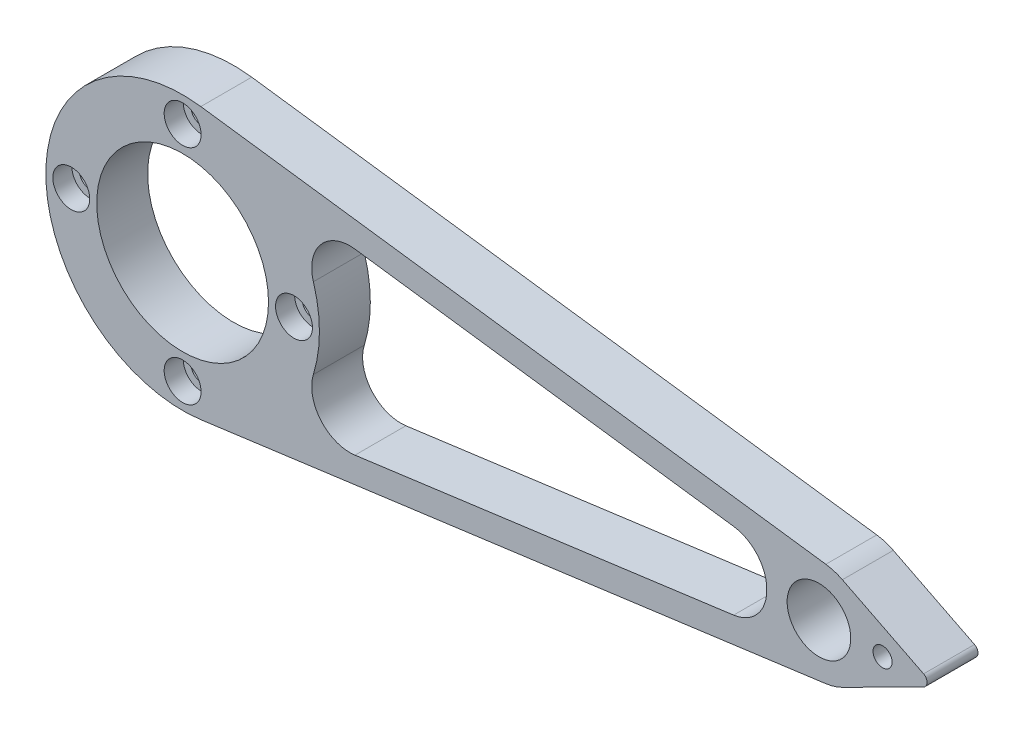
ISO-10303-21;
HEADER;
FILE_DESCRIPTION(('STEP AP214'),'2;1');
FILE_NAME('part.step','',(''),(''),'','','');
FILE_SCHEMA(('AUTOMOTIVE_DESIGN { 1 0 10303 214 1 1 1 1 }'));
ENDSEC;
DATA;
#1=APPLICATION_CONTEXT('core data for automotive mechanical design processes');
#2=APPLICATION_PROTOCOL_DEFINITION('international standard','automotive_design',2000,#1);
#3=PRODUCT_CONTEXT('',#1,'mechanical');
#4=PRODUCT('Part','Part','',(#3));
#5=PRODUCT_RELATED_PRODUCT_CATEGORY('part','',(#4));
#6=PRODUCT_DEFINITION_FORMATION('','',#4);
#7=PRODUCT_DEFINITION_CONTEXT('part definition',#1,'design');
#8=PRODUCT_DEFINITION('design','',#6,#7);
#9=PRODUCT_DEFINITION_SHAPE('','',#8);
#10=(LENGTH_UNIT() NAMED_UNIT(*) SI_UNIT(.MILLI.,.METRE.));
#11=(NAMED_UNIT(*) PLANE_ANGLE_UNIT() SI_UNIT($,.RADIAN.));
#12=(NAMED_UNIT(*) SI_UNIT($,.STERADIAN.) SOLID_ANGLE_UNIT());
#13=UNCERTAINTY_MEASURE_WITH_UNIT(LENGTH_MEASURE(1.E-05),#10,'distance_accuracy_value','');
#14=(GEOMETRIC_REPRESENTATION_CONTEXT(3) GLOBAL_UNCERTAINTY_ASSIGNED_CONTEXT((#13)) GLOBAL_UNIT_ASSIGNED_CONTEXT((#10,
#11,#12)) REPRESENTATION_CONTEXT('',''));
#15=CARTESIAN_POINT('',(0.,0.,0.));
#16=DIRECTION('',(0.,0.,1.));
#17=DIRECTION('',(1.,0.,0.));
#18=AXIS2_PLACEMENT_3D('',#15,#16,#17);
#19=CARTESIAN_POINT('',(17.5000000000002,1.70499640412445E-13,8.));
#20=DIRECTION('',(0.,0.,-1.));
#21=DIRECTION('',(-1.,0.,0.));
#22=AXIS2_PLACEMENT_3D('',#19,#20,#21);
#23=CYLINDRICAL_SURFACE('',#22,1.7);
#24=CARTESIAN_POINT('',(17.5000000000002,1.70499640412445E-13,0.));
#25=DIRECTION('',(0.,0.,1.));
#26=DIRECTION('',(1.,0.,0.));
#27=AXIS2_PLACEMENT_3D('',#24,#25,#26);
#28=CIRCLE('',#27,1.7);
#29=CARTESIAN_POINT('',(19.2000000000002,1.70499640412445E-13,0.));
#30=VERTEX_POINT('',#29);
#31=EDGE_CURVE('E211',#30,#30,#28,.T.);
#32=ORIENTED_EDGE('',*,*,#31,.F.);
#33=EDGE_LOOP('',(#32));
#34=FACE_BOUND('',#33,.T.);
#35=CARTESIAN_POINT('',(17.5000000000002,1.70499640412445E-13,5.));
#36=DIRECTION('',(0.,0.,1.));
#37=DIRECTION('',(1.,0.,0.));
#38=AXIS2_PLACEMENT_3D('',#35,#36,#37);
#39=CIRCLE('',#38,1.7);
#40=CARTESIAN_POINT('',(19.2000000000002,1.70499640412445E-13,5.));
#41=VERTEX_POINT('',#40);
#42=EDGE_CURVE('E37',#41,#41,#39,.T.);
#43=ORIENTED_EDGE('',*,*,#42,.T.);
#44=EDGE_LOOP('',(#43));
#45=FACE_BOUND('',#44,.T.);
#46=ADVANCED_FACE('F33',(#34,#45),#23,.F.);
#47=CARTESIAN_POINT('',(3.40999280824891E-13,-17.5,8.));
#48=DIRECTION('',(0.,0.,-1.));
#49=DIRECTION('',(-1.,0.,0.));
#50=AXIS2_PLACEMENT_3D('',#47,#48,#49);
#51=CYLINDRICAL_SURFACE('',#50,1.7);
#52=CARTESIAN_POINT('',(3.40999280824891E-13,-17.5,0.));
#53=DIRECTION('',(0.,0.,1.));
#54=DIRECTION('',(1.,0.,0.));
#55=AXIS2_PLACEMENT_3D('',#52,#53,#54);
#56=CIRCLE('',#55,1.7);
#57=CARTESIAN_POINT('',(1.70000000000034,-17.5,0.));
#58=VERTEX_POINT('',#57);
#59=EDGE_CURVE('E208',#58,#58,#56,.T.);
#60=ORIENTED_EDGE('',*,*,#59,.F.);
#61=EDGE_LOOP('',(#60));
#62=FACE_BOUND('',#61,.T.);
#63=CARTESIAN_POINT('',(3.40999280824891E-13,-17.5,5.));
#64=DIRECTION('',(0.,0.,1.));
#65=DIRECTION('',(1.,0.,0.));
#66=AXIS2_PLACEMENT_3D('',#63,#64,#65);
#67=CIRCLE('',#66,1.7);
#68=CARTESIAN_POINT('',(1.70000000000034,-17.5,5.));
#69=VERTEX_POINT('',#68);
#70=EDGE_CURVE('E268',#69,#69,#67,.T.);
#71=ORIENTED_EDGE('',*,*,#70,.T.);
#72=EDGE_LOOP('',(#71));
#73=FACE_BOUND('',#72,.T.);
#74=ADVANCED_FACE('F355',(#62,#73),#51,.F.);
#75=CARTESIAN_POINT('',(-17.4999999999998,-1.72642772310953E-13,8.));
#76=DIRECTION('',(0.,0.,-1.));
#77=DIRECTION('',(-1.,0.,0.));
#78=AXIS2_PLACEMENT_3D('',#75,#76,#77);
#79=CYLINDRICAL_SURFACE('',#78,1.7);
#80=CARTESIAN_POINT('',(-17.4999999999998,-1.72642772310953E-13,0.));
#81=DIRECTION('',(0.,0.,1.));
#82=DIRECTION('',(1.,0.,0.));
#83=AXIS2_PLACEMENT_3D('',#80,#81,#82);
#84=CIRCLE('',#83,1.7);
#85=CARTESIAN_POINT('',(-15.7999999999998,-1.72642772310953E-13,0.));
#86=VERTEX_POINT('',#85);
#87=EDGE_CURVE('E199',#86,#86,#84,.T.);
#88=ORIENTED_EDGE('',*,*,#87,.F.);
#89=EDGE_LOOP('',(#88));
#90=FACE_BOUND('',#89,.T.);
#91=CARTESIAN_POINT('',(-17.4999999999998,-1.72642772310953E-13,5.));
#92=DIRECTION('',(0.,0.,1.));
#93=DIRECTION('',(1.,0.,0.));
#94=AXIS2_PLACEMENT_3D('',#91,#92,#93);
#95=CIRCLE('',#94,1.7);
#96=CARTESIAN_POINT('',(-15.7999999999998,-1.72642772310953E-13,5.));
#97=VERTEX_POINT('',#96);
#98=EDGE_CURVE('E266',#97,#97,#95,.T.);
#99=ORIENTED_EDGE('',*,*,#98,.T.);
#100=EDGE_LOOP('',(#99));
#101=FACE_BOUND('',#100,.T.);
#102=ADVANCED_FACE('F361',(#90,#101),#79,.F.);
#103=CARTESIAN_POINT('',(0.,17.5,8.));
#104=DIRECTION('',(0.,0.,-1.));
#105=DIRECTION('',(-1.,0.,0.));
#106=AXIS2_PLACEMENT_3D('',#103,#104,#105);
#107=CYLINDRICAL_SURFACE('',#106,1.7);
#108=CARTESIAN_POINT('',(0.,17.5,0.));
#109=DIRECTION('',(0.,0.,1.));
#110=DIRECTION('',(1.,0.,0.));
#111=AXIS2_PLACEMENT_3D('',#108,#109,#110);
#112=CIRCLE('',#111,1.7);
#113=CARTESIAN_POINT('',(1.7,17.5,0.));
#114=VERTEX_POINT('',#113);
#115=EDGE_CURVE('E218',#114,#114,#112,.T.);
#116=ORIENTED_EDGE('',*,*,#115,.F.);
#117=EDGE_LOOP('',(#116));
#118=FACE_BOUND('',#117,.T.);
#119=CARTESIAN_POINT('',(0.,17.5,5.));
#120=DIRECTION('',(0.,0.,1.));
#121=DIRECTION('',(1.,0.,0.));
#122=AXIS2_PLACEMENT_3D('',#119,#120,#121);
#123=CIRCLE('',#122,1.7);
#124=CARTESIAN_POINT('',(1.7,17.5,5.));
#125=VERTEX_POINT('',#124);
#126=EDGE_CURVE('E261',#125,#125,#123,.T.);
#127=ORIENTED_EDGE('',*,*,#126,.T.);
#128=EDGE_LOOP('',(#127));
#129=FACE_BOUND('',#128,.T.);
#130=ADVANCED_FACE('F373',(#118,#129),#107,.F.);
#131=CARTESIAN_POINT('',(100.,0.,0.));
#132=DIRECTION('',(0.,0.,1.));
#133=DIRECTION('',(1.,0.,0.));
#134=AXIS2_PLACEMENT_3D('',#131,#132,#133);
#135=CYLINDRICAL_SURFACE('',#134,8.2);
#136=CARTESIAN_POINT('',(100.,0.,8.));
#137=DIRECTION('',(0.,0.,1.));
#138=DIRECTION('',(1.,0.,0.));
#139=AXIS2_PLACEMENT_3D('',#136,#137,#138);
#140=CIRCLE('',#139,8.2);
#141=CARTESIAN_POINT('',(103.69,7.32283415079161,8.));
#142=VERTEX_POINT('',#141);
#143=CARTESIAN_POINT('',(101.0906,8.12715150836995,8.));
#144=VERTEX_POINT('',#143);
#145=EDGE_CURVE('E190',#142,#144,#140,.T.);
#146=ORIENTED_EDGE('',*,*,#145,.F.);
#147=DIRECTION('',(0.,0.,1.));
#148=VECTOR('',#147,1.);
#149=CARTESIAN_POINT('',(103.69,7.32283415079163,0.));
#150=LINE('',#149,#148);
#151=CARTESIAN_POINT('',(103.69,7.32283415079163,0.));
#152=VERTEX_POINT('',#151);
#153=EDGE_CURVE('E296',#152,#142,#150,.T.);
#154=ORIENTED_EDGE('',*,*,#153,.F.);
#155=CARTESIAN_POINT('',(100.,0.,0.));
#156=DIRECTION('',(0.,0.,1.));
#157=DIRECTION('',(1.,0.,0.));
#158=AXIS2_PLACEMENT_3D('',#155,#156,#157);
#159=CIRCLE('',#158,8.2);
#160=CARTESIAN_POINT('',(101.0906,8.12715150836995,0.));
#161=VERTEX_POINT('',#160);
#162=EDGE_CURVE('E179',#152,#161,#159,.T.);
#163=ORIENTED_EDGE('',*,*,#162,.T.);
#164=DIRECTION('',(0.,0.,1.));
#165=VECTOR('',#164,1.);
#166=CARTESIAN_POINT('',(101.0906,8.12715150836995,0.));
#167=LINE('',#166,#165);
#168=EDGE_CURVE('E200',#161,#144,#167,.T.);
#169=ORIENTED_EDGE('',*,*,#168,.T.);
#170=EDGE_LOOP('',(#146,#154,#163,#169));
#171=FACE_BOUND('',#170,.T.);
#172=ADVANCED_FACE('F333',(#171),#135,.T.);
#173=CARTESIAN_POINT('',(0.,0.,8.));
#174=DIRECTION('',(0.,0.,1.));
#175=DIRECTION('',(1.,0.,0.));
#176=AXIS2_PLACEMENT_3D('',#173,#174,#175);
#177=PLANE('',#176);
#178=CARTESIAN_POINT('',(17.5000000000002,1.70499640412445E-13,8.));
#179=DIRECTION('',(0.,0.,1.));
#180=DIRECTION('',(1.,0.,0.));
#181=AXIS2_PLACEMENT_3D('',#178,#179,#180);
#182=CIRCLE('',#181,2.9);
#183=CARTESIAN_POINT('',(20.4000000000002,1.70499640412445E-13,8.));
#184=VERTEX_POINT('',#183);
#185=EDGE_CURVE('E491',#184,#184,#182,.T.);
#186=ORIENTED_EDGE('',*,*,#185,.F.);
#187=EDGE_LOOP('',(#186));
#188=FACE_BOUND('',#187,.T.);
#189=CARTESIAN_POINT('',(3.40999280824891E-13,-17.5,8.));
#190=DIRECTION('',(0.,0.,1.));
#191=DIRECTION('',(1.,0.,0.));
#192=AXIS2_PLACEMENT_3D('',#189,#190,#191);
#193=CIRCLE('',#192,2.9);
#194=CARTESIAN_POINT('',(2.90000000000034,-17.5,8.));
#195=VERTEX_POINT('',#194);
#196=EDGE_CURVE('E481',#195,#195,#193,.T.);
#197=ORIENTED_EDGE('',*,*,#196,.F.);
#198=EDGE_LOOP('',(#197));
#199=FACE_BOUND('',#198,.T.);
#200=CARTESIAN_POINT('',(-17.4999999999998,-1.72642772310953E-13,8.));
#201=DIRECTION('',(0.,0.,1.));
#202=DIRECTION('',(1.,0.,0.));
#203=AXIS2_PLACEMENT_3D('',#200,#201,#202);
#204=CIRCLE('',#203,2.9);
#205=CARTESIAN_POINT('',(-14.5999999999998,-1.72642772310953E-13,8.));
#206=VERTEX_POINT('',#205);
#207=EDGE_CURVE('E482',#206,#206,#204,.T.);
#208=ORIENTED_EDGE('',*,*,#207,.F.);
#209=EDGE_LOOP('',(#208));
#210=FACE_BOUND('',#209,.T.);
#211=CARTESIAN_POINT('',(0.,17.5,8.));
#212=DIRECTION('',(0.,0.,1.));
#213=DIRECTION('',(1.,0.,0.));
#214=AXIS2_PLACEMENT_3D('',#211,#212,#213);
#215=CIRCLE('',#214,2.9);
#216=CARTESIAN_POINT('',(2.9,17.5,8.));
#217=VERTEX_POINT('',#216);
#218=EDGE_CURVE('E274',#217,#217,#215,.T.);
#219=ORIENTED_EDGE('',*,*,#218,.F.);
#220=EDGE_LOOP('',(#219));
#221=FACE_BOUND('',#220,.T.);
#222=CARTESIAN_POINT('',(0.,0.,8.));
#223=DIRECTION('',(0.,0.,-1.));
#224=DIRECTION('',(1.,0.,0.));
#225=AXIS2_PLACEMENT_3D('',#222,#223,#224);
#226=CIRCLE('',#225,21.5);
#227=CARTESIAN_POINT('',(20.5521007166775,6.31356920699729,8.));
#228=VERTEX_POINT('',#227);
#229=CARTESIAN_POINT('',(20.5521007166775,-6.31356920699729,8.));
#230=VERTEX_POINT('',#229);
#231=EDGE_CURVE('E298',#228,#230,#226,.T.);
#232=ORIENTED_EDGE('',*,*,#231,.F.);
#233=CARTESIAN_POINT('',(26.2875706841224,8.07549549732211,8.));
#234=DIRECTION('',(0.,0.,1.));
#235=DIRECTION('',(1.,0.,0.));
#236=AXIS2_PLACEMENT_3D('',#233,#234,#235);
#237=CIRCLE('',#236,6.);
#238=CARTESIAN_POINT('',(27.0855706841224,14.0221917229587,8.));
#239=VERTEX_POINT('',#238);
#240=EDGE_CURVE('E42',#228,#239,#237,.F.);
#241=ORIENTED_EDGE('',*,*,#240,.T.);
#242=DIRECTION('',(-0.991116037606092,0.133,0.));
#243=VECTOR('',#242,1.);
#244=CARTESIAN_POINT('',(14.7065353420612,15.6833611905326,8.));
#245=LINE('',#244,#243);
#246=CARTESIAN_POINT('',(86.5982811497731,6.03605267202611,8.));
#247=VERTEX_POINT('',#246);
#248=EDGE_CURVE('E305',#247,#239,#245,.T.);
#249=ORIENTED_EDGE('',*,*,#248,.F.);
#250=CARTESIAN_POINT('',(85.8002811497731,0.089356446389553,8.));
#251=DIRECTION('',(0.,0.,1.));
#252=DIRECTION('',(1.,0.,0.));
#253=AXIS2_PLACEMENT_3D('',#250,#251,#252);
#254=CIRCLE('',#253,6.);
#255=CARTESIAN_POINT('',(91.8001623540944,0.0516002014362207,8.));
#256=VERTEX_POINT('',#255);
#257=EDGE_CURVE('E252',#247,#256,#254,.F.);
#258=ORIENTED_EDGE('',*,*,#257,.T.);
#259=CARTESIAN_POINT('',(100.,0.,8.));
#260=DIRECTION('',(0.,0.,-1.));
#261=DIRECTION('',(1.,0.,0.));
#262=AXIS2_PLACEMENT_3D('',#259,#260,#261);
#263=CIRCLE('',#262,8.19999999999999);
#264=CARTESIAN_POINT('',(91.8001623540944,-0.0516002014362207,8.));
#265=VERTEX_POINT('',#264);
#266=EDGE_CURVE('E319',#265,#256,#263,.T.);
#267=ORIENTED_EDGE('',*,*,#266,.F.);
#268=CARTESIAN_POINT('',(85.8002811497731,-0.089356446389553,8.));
#269=DIRECTION('',(0.,0.,1.));
#270=DIRECTION('',(1.,0.,0.));
#271=AXIS2_PLACEMENT_3D('',#268,#269,#270);
#272=CIRCLE('',#271,6.);
#273=CARTESIAN_POINT('',(86.5982811497731,-6.03605267202611,8.));
#274=VERTEX_POINT('',#273);
#275=EDGE_CURVE('E248',#265,#274,#272,.F.);
#276=ORIENTED_EDGE('',*,*,#275,.T.);
#277=DIRECTION('',(0.991116037606092,0.133,0.));
#278=VECTOR('',#277,1.);
#279=CARTESIAN_POINT('',(14.7065353420612,-15.6833611905326,8.));
#280=LINE('',#279,#278);
#281=CARTESIAN_POINT('',(27.0855706841224,-14.0221917229587,8.));
#282=VERTEX_POINT('',#281);
#283=EDGE_CURVE('E316',#282,#274,#280,.T.);
#284=ORIENTED_EDGE('',*,*,#283,.F.);
#285=CARTESIAN_POINT('',(26.2875706841224,-8.07549549732211,8.));
#286=DIRECTION('',(0.,0.,1.));
#287=DIRECTION('',(1.,0.,0.));
#288=AXIS2_PLACEMENT_3D('',#285,#286,#287);
#289=CIRCLE('',#288,6.);
#290=EDGE_CURVE('E256',#282,#230,#289,.F.);
#291=ORIENTED_EDGE('',*,*,#290,.T.);
#292=EDGE_LOOP('',(#232,#241,#249,#258,#267,#276,#284,#291));
#293=FACE_BOUND('',#292,.T.);
#294=CARTESIAN_POINT('',(0.,0.,8.));
#295=DIRECTION('',(0.,0.,1.));
#296=DIRECTION('',(1.,0.,0.));
#297=AXIS2_PLACEMENT_3D('',#294,#295,#296);
#298=CIRCLE('',#297,13.5);
#299=CARTESIAN_POINT('',(13.5,0.,8.));
#300=VERTEX_POINT('',#299);
#301=EDGE_CURVE('E215',#300,#300,#298,.T.);
#302=ORIENTED_EDGE('',*,*,#301,.F.);
#303=EDGE_LOOP('',(#302));
#304=FACE_BOUND('',#303,.T.);
#305=CARTESIAN_POINT('',(0.,0.,8.));
#306=DIRECTION('',(0.,0.,1.));
#307=DIRECTION('',(1.,0.,0.));
#308=AXIS2_PLACEMENT_3D('',#305,#306,#307);
#309=CIRCLE('',#308,21.5);
#310=CARTESIAN_POINT('',(2.8595,21.308994808531,8.));
#311=VERTEX_POINT('',#310);
#312=CARTESIAN_POINT('',(2.8595,-21.308994808531,8.));
#313=VERTEX_POINT('',#312);
#314=EDGE_CURVE('E224',#311,#313,#309,.T.);
#315=ORIENTED_EDGE('',*,*,#314,.T.);
#316=DIRECTION('',(0.991116037606092,0.133,0.));
#317=VECTOR('',#316,1.);
#318=CARTESIAN_POINT('',(2.8595,-21.308994808531,8.));
#319=LINE('',#318,#317);
#320=CARTESIAN_POINT('',(101.0906,-8.12715150836995,8.));
#321=VERTEX_POINT('',#320);
#322=EDGE_CURVE('E187',#313,#321,#319,.T.);
#323=ORIENTED_EDGE('',*,*,#322,.T.);
#324=CARTESIAN_POINT('',(103.69,-7.32283415079163,8.));
#325=VERTEX_POINT('',#324);
#326=EDGE_CURVE('E192',#321,#325,#140,.T.);
#327=ORIENTED_EDGE('',*,*,#326,.T.);
#328=DIRECTION('',(0.893028554974587,0.45,0.));
#329=VECTOR('',#328,1.);
#330=CARTESIAN_POINT('',(103.69,-7.32283415079163,8.));
#331=LINE('',#330,#329);
#332=CARTESIAN_POINT('',(116.45,-0.8930285549746,8.));
#333=VERTEX_POINT('',#332);
#334=EDGE_CURVE('E155',#325,#333,#331,.T.);
#335=ORIENTED_EDGE('',*,*,#334,.T.);
#336=CARTESIAN_POINT('',(116.,0.,8.));
#337=DIRECTION('',(0.,0.,1.));
#338=DIRECTION('',(1.,0.,0.));
#339=AXIS2_PLACEMENT_3D('',#336,#337,#338);
#340=CIRCLE('',#339,1.00000000000001);
#341=CARTESIAN_POINT('',(116.45,0.8930285549746,8.));
#342=VERTEX_POINT('',#341);
#343=EDGE_CURVE('E293',#333,#342,#340,.T.);
#344=ORIENTED_EDGE('',*,*,#343,.T.);
#345=DIRECTION('',(-0.893028554974587,0.45,0.));
#346=VECTOR('',#345,1.);
#347=CARTESIAN_POINT('',(103.69,7.32283415079163,8.));
#348=LINE('',#347,#346);
#349=EDGE_CURVE('E50',#342,#142,#348,.T.);
#350=ORIENTED_EDGE('',*,*,#349,.T.);
#351=ORIENTED_EDGE('',*,*,#145,.T.);
#352=DIRECTION('',(-0.991116037606092,0.133,0.));
#353=VECTOR('',#352,1.);
#354=CARTESIAN_POINT('',(2.8595,21.308994808531,8.));
#355=LINE('',#354,#353);
#356=EDGE_CURVE('E194',#144,#311,#355,.T.);
#357=ORIENTED_EDGE('',*,*,#356,.T.);
#358=EDGE_LOOP('',(#315,#323,#327,#335,#344,#350,#351,#357));
#359=FACE_BOUND('',#358,.T.);
#360=CARTESIAN_POINT('',(100.,0.,8.));
#361=DIRECTION('',(0.,0.,1.));
#362=DIRECTION('',(1.,0.,0.));
#363=AXIS2_PLACEMENT_3D('',#360,#361,#362);
#364=CIRCLE('',#363,5.);
#365=CARTESIAN_POINT('',(105.,0.,8.));
#366=VERTEX_POINT('',#365);
#367=EDGE_CURVE('E314',#366,#366,#364,.T.);
#368=ORIENTED_EDGE('',*,*,#367,.F.);
#369=EDGE_LOOP('',(#368));
#370=FACE_BOUND('',#369,.T.);
#371=CARTESIAN_POINT('',(110.,0.,8.));
#372=DIRECTION('',(0.,0.,1.));
#373=DIRECTION('',(1.,0.,0.));
#374=AXIS2_PLACEMENT_3D('',#371,#372,#373);
#375=CIRCLE('',#374,1.5);
#376=CARTESIAN_POINT('',(111.5,0.,8.));
#377=VERTEX_POINT('',#376);
#378=EDGE_CURVE('E264',#377,#377,#375,.T.);
#379=ORIENTED_EDGE('',*,*,#378,.F.);
#380=EDGE_LOOP('',(#379));
#381=FACE_BOUND('',#380,.T.);
#382=ADVANCED_FACE('F330',(#188,#199,#210,#221,#293,#304,#359,#370,#381),#177,.T.);
#383=CARTESIAN_POINT('',(0.,0.,0.));
#384=DIRECTION('',(0.,0.,1.));
#385=DIRECTION('',(1.,0.,0.));
#386=AXIS2_PLACEMENT_3D('',#383,#384,#385);
#387=PLANE('',#386);
#388=CARTESIAN_POINT('',(100.,0.,0.));
#389=DIRECTION('',(0.,0.,-1.));
#390=DIRECTION('',(1.,0.,0.));
#391=AXIS2_PLACEMENT_3D('',#388,#389,#390);
#392=CIRCLE('',#391,8.19999999999999);
#393=CARTESIAN_POINT('',(91.8001623540944,-0.0516002014362207,0.));
#394=VERTEX_POINT('',#393);
#395=CARTESIAN_POINT('',(91.8001623540944,0.0516002014362207,0.));
#396=VERTEX_POINT('',#395);
#397=EDGE_CURVE('E308',#394,#396,#392,.T.);
#398=ORIENTED_EDGE('',*,*,#397,.T.);
#399=CARTESIAN_POINT('',(85.8002811497731,0.089356446389553,0.));
#400=DIRECTION('',(0.,0.,1.));
#401=DIRECTION('',(1.,0.,0.));
#402=AXIS2_PLACEMENT_3D('',#399,#400,#401);
#403=CIRCLE('',#402,6.);
#404=CARTESIAN_POINT('',(86.5982811497731,6.03605267202611,0.));
#405=VERTEX_POINT('',#404);
#406=EDGE_CURVE('E254',#396,#405,#403,.T.);
#407=ORIENTED_EDGE('',*,*,#406,.T.);
#408=DIRECTION('',(-0.991116037606092,0.133,0.));
#409=VECTOR('',#408,1.);
#410=CARTESIAN_POINT('',(14.7065353420612,15.6833611905326,0.));
#411=LINE('',#410,#409);
#412=CARTESIAN_POINT('',(27.0855706841224,14.0221917229587,0.));
#413=VERTEX_POINT('',#412);
#414=EDGE_CURVE('E311',#405,#413,#411,.T.);
#415=ORIENTED_EDGE('',*,*,#414,.T.);
#416=CARTESIAN_POINT('',(26.2875706841224,8.07549549732211,0.));
#417=DIRECTION('',(0.,0.,1.));
#418=DIRECTION('',(1.,0.,0.));
#419=AXIS2_PLACEMENT_3D('',#416,#417,#418);
#420=CIRCLE('',#419,6.);
#421=CARTESIAN_POINT('',(20.5521007166775,6.31356920699729,0.));
#422=VERTEX_POINT('',#421);
#423=EDGE_CURVE('E11',#413,#422,#420,.T.);
#424=ORIENTED_EDGE('',*,*,#423,.T.);
#425=CARTESIAN_POINT('',(0.,0.,0.));
#426=DIRECTION('',(0.,0.,-1.));
#427=DIRECTION('',(1.,0.,0.));
#428=AXIS2_PLACEMENT_3D('',#425,#426,#427);
#429=CIRCLE('',#428,21.5);
#430=CARTESIAN_POINT('',(20.5521007166775,-6.31356920699729,0.));
#431=VERTEX_POINT('',#430);
#432=EDGE_CURVE('E302',#422,#431,#429,.T.);
#433=ORIENTED_EDGE('',*,*,#432,.T.);
#434=CARTESIAN_POINT('',(26.2875706841224,-8.07549549732211,0.));
#435=DIRECTION('',(0.,0.,1.));
#436=DIRECTION('',(1.,0.,0.));
#437=AXIS2_PLACEMENT_3D('',#434,#435,#436);
#438=CIRCLE('',#437,6.);
#439=CARTESIAN_POINT('',(27.0855706841224,-14.0221917229587,0.));
#440=VERTEX_POINT('',#439);
#441=EDGE_CURVE('E258',#431,#440,#438,.T.);
#442=ORIENTED_EDGE('',*,*,#441,.T.);
#443=DIRECTION('',(0.991116037606092,0.133,0.));
#444=VECTOR('',#443,1.);
#445=CARTESIAN_POINT('',(14.7065353420612,-15.6833611905326,0.));
#446=LINE('',#445,#444);
#447=CARTESIAN_POINT('',(86.5982811497731,-6.03605267202611,0.));
#448=VERTEX_POINT('',#447);
#449=EDGE_CURVE('E304',#440,#448,#446,.T.);
#450=ORIENTED_EDGE('',*,*,#449,.T.);
#451=CARTESIAN_POINT('',(85.8002811497731,-0.089356446389553,0.));
#452=DIRECTION('',(0.,0.,1.));
#453=DIRECTION('',(1.,0.,0.));
#454=AXIS2_PLACEMENT_3D('',#451,#452,#453);
#455=CIRCLE('',#454,6.);
#456=EDGE_CURVE('E250',#448,#394,#455,.T.);
#457=ORIENTED_EDGE('',*,*,#456,.T.);
#458=EDGE_LOOP('',(#398,#407,#415,#424,#433,#442,#450,#457));
#459=FACE_BOUND('',#458,.T.);
#460=CARTESIAN_POINT('',(0.,0.,0.));
#461=DIRECTION('',(0.,0.,1.));
#462=DIRECTION('',(1.,0.,0.));
#463=AXIS2_PLACEMENT_3D('',#460,#461,#462);
#464=CIRCLE('',#463,21.5);
#465=CARTESIAN_POINT('',(2.8595,21.308994808531,0.));
#466=VERTEX_POINT('',#465);
#467=CARTESIAN_POINT('',(2.8595,-21.308994808531,0.));
#468=VERTEX_POINT('',#467);
#469=EDGE_CURVE('E223',#466,#468,#464,.T.);
#470=ORIENTED_EDGE('',*,*,#469,.F.);
#471=DIRECTION('',(-0.991116037606092,0.133,0.));
#472=VECTOR('',#471,1.);
#473=CARTESIAN_POINT('',(2.8595,21.308994808531,0.));
#474=LINE('',#473,#472);
#475=EDGE_CURVE('E178',#161,#466,#474,.T.);
#476=ORIENTED_EDGE('',*,*,#475,.F.);
#477=ORIENTED_EDGE('',*,*,#162,.F.);
#478=DIRECTION('',(-0.893028554974587,0.45,0.));
#479=VECTOR('',#478,1.);
#480=CARTESIAN_POINT('',(103.69,7.32283415079163,0.));
#481=LINE('',#480,#479);
#482=CARTESIAN_POINT('',(116.45,0.8930285549746,0.));
#483=VERTEX_POINT('',#482);
#484=EDGE_CURVE('E161',#483,#152,#481,.T.);
#485=ORIENTED_EDGE('',*,*,#484,.F.);
#486=CARTESIAN_POINT('',(116.,0.,0.));
#487=DIRECTION('',(0.,0.,1.));
#488=DIRECTION('',(1.,0.,0.));
#489=AXIS2_PLACEMENT_3D('',#486,#487,#488);
#490=CIRCLE('',#489,1.00000000000001);
#491=CARTESIAN_POINT('',(116.45,-0.8930285549746,0.));
#492=VERTEX_POINT('',#491);
#493=EDGE_CURVE('E174',#492,#483,#490,.T.);
#494=ORIENTED_EDGE('',*,*,#493,.F.);
#495=DIRECTION('',(0.893028554974587,0.45,0.));
#496=VECTOR('',#495,1.);
#497=CARTESIAN_POINT('',(103.69,-7.32283415079163,0.));
#498=LINE('',#497,#496);
#499=CARTESIAN_POINT('',(103.69,-7.32283415079163,0.));
#500=VERTEX_POINT('',#499);
#501=EDGE_CURVE('E153',#500,#492,#498,.T.);
#502=ORIENTED_EDGE('',*,*,#501,.F.);
#503=CARTESIAN_POINT('',(101.0906,-8.12715150836995,0.));
#504=VERTEX_POINT('',#503);
#505=EDGE_CURVE('E170',#504,#500,#159,.T.);
#506=ORIENTED_EDGE('',*,*,#505,.F.);
#507=DIRECTION('',(0.991116037606092,0.133,0.));
#508=VECTOR('',#507,1.);
#509=CARTESIAN_POINT('',(2.8595,-21.308994808531,0.));
#510=LINE('',#509,#508);
#511=EDGE_CURVE('E183',#468,#504,#510,.T.);
#512=ORIENTED_EDGE('',*,*,#511,.F.);
#513=EDGE_LOOP('',(#470,#476,#477,#485,#494,#502,#506,#512));
#514=FACE_BOUND('',#513,.T.);
#515=ORIENTED_EDGE('',*,*,#115,.T.);
#516=EDGE_LOOP('',(#515));
#517=FACE_BOUND('',#516,.T.);
#518=CARTESIAN_POINT('',(0.,0.,0.));
#519=DIRECTION('',(0.,0.,1.));
#520=DIRECTION('',(1.,0.,0.));
#521=AXIS2_PLACEMENT_3D('',#518,#519,#520);
#522=CIRCLE('',#521,13.5);
#523=CARTESIAN_POINT('',(13.5,0.,0.));
#524=VERTEX_POINT('',#523);
#525=EDGE_CURVE('E214',#524,#524,#522,.T.);
#526=ORIENTED_EDGE('',*,*,#525,.T.);
#527=EDGE_LOOP('',(#526));
#528=FACE_BOUND('',#527,.T.);
#529=ORIENTED_EDGE('',*,*,#31,.T.);
#530=EDGE_LOOP('',(#529));
#531=FACE_BOUND('',#530,.T.);
#532=ORIENTED_EDGE('',*,*,#59,.T.);
#533=EDGE_LOOP('',(#532));
#534=FACE_BOUND('',#533,.T.);
#535=ORIENTED_EDGE('',*,*,#87,.T.);
#536=EDGE_LOOP('',(#535));
#537=FACE_BOUND('',#536,.T.);
#538=CARTESIAN_POINT('',(100.,0.,0.));
#539=DIRECTION('',(0.,0.,1.));
#540=DIRECTION('',(1.,0.,0.));
#541=AXIS2_PLACEMENT_3D('',#538,#539,#540);
#542=CIRCLE('',#541,5.);
#543=CARTESIAN_POINT('',(105.,0.,0.));
#544=VERTEX_POINT('',#543);
#545=EDGE_CURVE('E191',#544,#544,#542,.T.);
#546=ORIENTED_EDGE('',*,*,#545,.T.);
#547=EDGE_LOOP('',(#546));
#548=FACE_BOUND('',#547,.T.);
#549=CARTESIAN_POINT('',(110.,0.,0.));
#550=DIRECTION('',(0.,0.,1.));
#551=DIRECTION('',(1.,0.,0.));
#552=AXIS2_PLACEMENT_3D('',#549,#550,#551);
#553=CIRCLE('',#552,1.5);
#554=CARTESIAN_POINT('',(111.5,0.,0.));
#555=VERTEX_POINT('',#554);
#556=EDGE_CURVE('E285',#555,#555,#553,.T.);
#557=ORIENTED_EDGE('',*,*,#556,.T.);
#558=EDGE_LOOP('',(#557));
#559=FACE_BOUND('',#558,.T.);
#560=ADVANCED_FACE('F167',(#459,#514,#517,#528,#531,#534,#537,#548,#559),#387,.F.);
#561=CARTESIAN_POINT('',(0.,0.,8.));
#562=DIRECTION('',(0.,0.,-1.));
#563=DIRECTION('',(-1.,0.,0.));
#564=AXIS2_PLACEMENT_3D('',#561,#562,#563);
#565=CYLINDRICAL_SURFACE('',#564,21.5);
#566=ORIENTED_EDGE('',*,*,#314,.F.);
#567=DIRECTION('',(0.,0.,1.));
#568=VECTOR('',#567,1.);
#569=CARTESIAN_POINT('',(2.8595,21.308994808531,0.));
#570=LINE('',#569,#568);
#571=EDGE_CURVE('E196',#466,#311,#570,.T.);
#572=ORIENTED_EDGE('',*,*,#571,.F.);
#573=ORIENTED_EDGE('',*,*,#469,.T.);
#574=DIRECTION('',(0.,0.,1.));
#575=VECTOR('',#574,1.);
#576=CARTESIAN_POINT('',(2.8595,-21.308994808531,0.));
#577=LINE('',#576,#575);
#578=EDGE_CURVE('E181',#468,#313,#577,.T.);
#579=ORIENTED_EDGE('',*,*,#578,.T.);
#580=EDGE_LOOP('',(#566,#572,#573,#579));
#581=FACE_BOUND('',#580,.T.);
#582=ADVANCED_FACE('F371',(#581),#565,.T.);
#583=CARTESIAN_POINT('',(0.,0.,8.));
#584=DIRECTION('',(0.,0.,-1.));
#585=DIRECTION('',(-1.,0.,0.));
#586=AXIS2_PLACEMENT_3D('',#583,#584,#585);
#587=CYLINDRICAL_SURFACE('',#586,13.5);
#588=ORIENTED_EDGE('',*,*,#301,.T.);
#589=EDGE_LOOP('',(#588));
#590=FACE_BOUND('',#589,.T.);
#591=ORIENTED_EDGE('',*,*,#525,.F.);
#592=EDGE_LOOP('',(#591));
#593=FACE_BOUND('',#592,.T.);
#594=ADVANCED_FACE('F367',(#590,#593),#587,.F.);
#595=CARTESIAN_POINT('',(2.8595,21.308994808531,0.));
#596=DIRECTION('',(0.133,0.991116037606092,0.));
#597=DIRECTION('',(-0.991116037606092,0.133,0.));
#598=AXIS2_PLACEMENT_3D('',#595,#596,#597);
#599=PLANE('',#598);
#600=ORIENTED_EDGE('',*,*,#356,.F.);
#601=ORIENTED_EDGE('',*,*,#168,.F.);
#602=ORIENTED_EDGE('',*,*,#475,.T.);
#603=ORIENTED_EDGE('',*,*,#571,.T.);
#604=EDGE_LOOP('',(#600,#601,#602,#603));
#605=FACE_BOUND('',#604,.T.);
#606=ADVANCED_FACE('F370',(#605),#599,.T.);
#607=DIRECTION('',(0.,0.,1.));
#608=VECTOR('',#607,1.);
#609=CARTESIAN_POINT('',(103.69,-7.32283415079163,0.));
#610=LINE('',#609,#608);
#611=EDGE_CURVE('E150',#500,#325,#610,.T.);
#612=ORIENTED_EDGE('',*,*,#611,.T.);
#613=ORIENTED_EDGE('',*,*,#326,.F.);
#614=DIRECTION('',(0.,0.,1.));
#615=VECTOR('',#614,1.);
#616=CARTESIAN_POINT('',(101.0906,-8.12715150836995,0.));
#617=LINE('',#616,#615);
#618=EDGE_CURVE('E177',#504,#321,#617,.T.);
#619=ORIENTED_EDGE('',*,*,#618,.F.);
#620=ORIENTED_EDGE('',*,*,#505,.T.);
#621=EDGE_LOOP('',(#612,#613,#619,#620));
#622=FACE_BOUND('',#621,.T.);
#623=ADVANCED_FACE('F176',(#622),#135,.T.);
#624=CARTESIAN_POINT('',(2.8595,-21.308994808531,0.));
#625=DIRECTION('',(0.133,-0.991116037606092,0.));
#626=DIRECTION('',(0.991116037606092,0.133,0.));
#627=AXIS2_PLACEMENT_3D('',#624,#625,#626);
#628=PLANE('',#627);
#629=ORIENTED_EDGE('',*,*,#322,.F.);
#630=ORIENTED_EDGE('',*,*,#578,.F.);
#631=ORIENTED_EDGE('',*,*,#511,.T.);
#632=ORIENTED_EDGE('',*,*,#618,.T.);
#633=EDGE_LOOP('',(#629,#630,#631,#632));
#634=FACE_BOUND('',#633,.T.);
#635=ADVANCED_FACE('F430',(#634),#628,.T.);
#636=CARTESIAN_POINT('',(100.,0.,0.));
#637=DIRECTION('',(0.,0.,1.));
#638=DIRECTION('',(1.,0.,0.));
#639=AXIS2_PLACEMENT_3D('',#636,#637,#638);
#640=CYLINDRICAL_SURFACE('',#639,5.);
#641=ORIENTED_EDGE('',*,*,#545,.F.);
#642=EDGE_LOOP('',(#641));
#643=FACE_BOUND('',#642,.T.);
#644=ORIENTED_EDGE('',*,*,#367,.T.);
#645=EDGE_LOOP('',(#644));
#646=FACE_BOUND('',#645,.T.);
#647=ADVANCED_FACE('F328',(#643,#646),#640,.F.);
#648=CARTESIAN_POINT('',(0.,0.,0.));
#649=DIRECTION('',(0.,0.,1.));
#650=DIRECTION('',(1.,0.,0.));
#651=AXIS2_PLACEMENT_3D('',#648,#649,#650);
#652=CYLINDRICAL_SURFACE('',#651,21.5);
#653=ORIENTED_EDGE('',*,*,#231,.T.);
#654=DIRECTION('',(0.,0.,1.));
#655=VECTOR('',#654,1.);
#656=CARTESIAN_POINT('',(20.5521007166775,-6.31356920699729,0.));
#657=LINE('',#656,#655);
#658=EDGE_CURVE('E58',#230,#431,#657,.F.);
#659=ORIENTED_EDGE('',*,*,#658,.T.);
#660=ORIENTED_EDGE('',*,*,#432,.F.);
#661=DIRECTION('',(0.,0.,1.));
#662=VECTOR('',#661,1.);
#663=CARTESIAN_POINT('',(20.5521007166775,6.31356920699729,0.));
#664=LINE('',#663,#662);
#665=EDGE_CURVE('E244',#422,#228,#664,.T.);
#666=ORIENTED_EDGE('',*,*,#665,.T.);
#667=EDGE_LOOP('',(#653,#659,#660,#666));
#668=FACE_BOUND('',#667,.T.);
#669=ADVANCED_FACE('F421',(#668),#652,.T.);
#670=CARTESIAN_POINT('',(14.7065353420612,15.6833611905326,0.));
#671=DIRECTION('',(0.133,0.991116037606092,0.));
#672=DIRECTION('',(-0.991116037606092,0.133,0.));
#673=AXIS2_PLACEMENT_3D('',#670,#671,#672);
#674=PLANE('',#673);
#675=ORIENTED_EDGE('',*,*,#414,.F.);
#676=DIRECTION('',(0.,0.,-1.));
#677=VECTOR('',#676,1.);
#678=CARTESIAN_POINT('',(86.5982811497731,6.03605267202611,8.));
#679=LINE('',#678,#677);
#680=EDGE_CURVE('E241',#405,#247,#679,.F.);
#681=ORIENTED_EDGE('',*,*,#680,.T.);
#682=ORIENTED_EDGE('',*,*,#248,.T.);
#683=DIRECTION('',(0.,0.,-1.));
#684=VECTOR('',#683,1.);
#685=CARTESIAN_POINT('',(27.0855706841224,14.0221917229587,0.));
#686=LINE('',#685,#684);
#687=EDGE_CURVE('E239',#239,#413,#686,.T.);
#688=ORIENTED_EDGE('',*,*,#687,.T.);
#689=EDGE_LOOP('',(#675,#681,#682,#688));
#690=FACE_BOUND('',#689,.T.);
#691=ADVANCED_FACE('F417',(#690),#674,.F.);
#692=CARTESIAN_POINT('',(100.,0.,0.));
#693=DIRECTION('',(0.,0.,1.));
#694=DIRECTION('',(1.,0.,0.));
#695=AXIS2_PLACEMENT_3D('',#692,#693,#694);
#696=CYLINDRICAL_SURFACE('',#695,8.19999999999999);
#697=ORIENTED_EDGE('',*,*,#397,.F.);
#698=DIRECTION('',(0.,0.,1.));
#699=VECTOR('',#698,1.);
#700=CARTESIAN_POINT('',(91.8001623540944,-0.0516002014362207,0.));
#701=LINE('',#700,#699);
#702=EDGE_CURVE('E231',#394,#265,#701,.T.);
#703=ORIENTED_EDGE('',*,*,#702,.T.);
#704=ORIENTED_EDGE('',*,*,#266,.T.);
#705=DIRECTION('',(0.,0.,1.));
#706=VECTOR('',#705,1.);
#707=CARTESIAN_POINT('',(91.8001623540944,0.0516002014362207,0.));
#708=LINE('',#707,#706);
#709=EDGE_CURVE('E227',#256,#396,#708,.F.);
#710=ORIENTED_EDGE('',*,*,#709,.T.);
#711=EDGE_LOOP('',(#697,#703,#704,#710));
#712=FACE_BOUND('',#711,.T.);
#713=ADVANCED_FACE('F410',(#712),#696,.T.);
#714=CARTESIAN_POINT('',(14.7065353420612,-15.6833611905326,0.));
#715=DIRECTION('',(0.133,-0.991116037606092,0.));
#716=DIRECTION('',(0.991116037606092,0.133,0.));
#717=AXIS2_PLACEMENT_3D('',#714,#715,#716);
#718=PLANE('',#717);
#719=ORIENTED_EDGE('',*,*,#283,.T.);
#720=DIRECTION('',(0.,0.,-1.));
#721=VECTOR('',#720,1.);
#722=CARTESIAN_POINT('',(86.5982811497731,-6.03605267202611,0.));
#723=LINE('',#722,#721);
#724=EDGE_CURVE('E237',#274,#448,#723,.T.);
#725=ORIENTED_EDGE('',*,*,#724,.T.);
#726=ORIENTED_EDGE('',*,*,#449,.F.);
#727=DIRECTION('',(0.,0.,-1.));
#728=VECTOR('',#727,1.);
#729=CARTESIAN_POINT('',(27.0855706841224,-14.0221917229587,8.));
#730=LINE('',#729,#728);
#731=EDGE_CURVE('E234',#440,#282,#730,.F.);
#732=ORIENTED_EDGE('',*,*,#731,.T.);
#733=EDGE_LOOP('',(#719,#725,#726,#732));
#734=FACE_BOUND('',#733,.T.);
#735=ADVANCED_FACE('F387',(#734),#718,.F.);
#736=CARTESIAN_POINT('',(85.8002811497731,-0.089356446389553,0.));
#737=DIRECTION('',(0.,0.,1.));
#738=DIRECTION('',(1.,0.,0.));
#739=AXIS2_PLACEMENT_3D('',#736,#737,#738);
#740=CYLINDRICAL_SURFACE('',#739,6.);
#741=ORIENTED_EDGE('',*,*,#456,.F.);
#742=ORIENTED_EDGE('',*,*,#724,.F.);
#743=ORIENTED_EDGE('',*,*,#275,.F.);
#744=ORIENTED_EDGE('',*,*,#702,.F.);
#745=EDGE_LOOP('',(#741,#742,#743,#744));
#746=FACE_BOUND('',#745,.T.);
#747=ADVANCED_FACE('F383',(#746),#740,.F.);
#748=CARTESIAN_POINT('',(85.8002811497731,0.089356446389553,0.));
#749=DIRECTION('',(0.,0.,1.));
#750=DIRECTION('',(1.,0.,0.));
#751=AXIS2_PLACEMENT_3D('',#748,#749,#750);
#752=CYLINDRICAL_SURFACE('',#751,6.);
#753=ORIENTED_EDGE('',*,*,#406,.F.);
#754=ORIENTED_EDGE('',*,*,#709,.F.);
#755=ORIENTED_EDGE('',*,*,#257,.F.);
#756=ORIENTED_EDGE('',*,*,#680,.F.);
#757=EDGE_LOOP('',(#753,#754,#755,#756));
#758=FACE_BOUND('',#757,.T.);
#759=ADVANCED_FACE('F386',(#758),#752,.F.);
#760=CARTESIAN_POINT('',(26.2875706841224,-8.07549549732211,0.));
#761=DIRECTION('',(0.,0.,1.));
#762=DIRECTION('',(1.,0.,0.));
#763=AXIS2_PLACEMENT_3D('',#760,#761,#762);
#764=CYLINDRICAL_SURFACE('',#763,6.);
#765=ORIENTED_EDGE('',*,*,#441,.F.);
#766=ORIENTED_EDGE('',*,*,#658,.F.);
#767=ORIENTED_EDGE('',*,*,#290,.F.);
#768=ORIENTED_EDGE('',*,*,#731,.F.);
#769=EDGE_LOOP('',(#765,#766,#767,#768));
#770=FACE_BOUND('',#769,.T.);
#771=ADVANCED_FACE('F390',(#770),#764,.F.);
#772=CARTESIAN_POINT('',(26.2875706841224,8.07549549732211,0.));
#773=DIRECTION('',(0.,0.,1.));
#774=DIRECTION('',(1.,0.,0.));
#775=AXIS2_PLACEMENT_3D('',#772,#773,#774);
#776=CYLINDRICAL_SURFACE('',#775,6.);
#777=ORIENTED_EDGE('',*,*,#423,.F.);
#778=ORIENTED_EDGE('',*,*,#687,.F.);
#779=ORIENTED_EDGE('',*,*,#240,.F.);
#780=ORIENTED_EDGE('',*,*,#665,.F.);
#781=EDGE_LOOP('',(#777,#778,#779,#780));
#782=FACE_BOUND('',#781,.T.);
#783=ADVANCED_FACE('F35',(#782),#776,.F.);
#784=CARTESIAN_POINT('',(103.69,7.32283415079163,0.));
#785=DIRECTION('',(0.45,0.893028554974587,0.));
#786=DIRECTION('',(-0.893028554974588,0.45,0.));
#787=AXIS2_PLACEMENT_3D('',#784,#785,#786);
#788=PLANE('',#787);
#789=ORIENTED_EDGE('',*,*,#349,.F.);
#790=DIRECTION('',(0.,0.,1.));
#791=VECTOR('',#790,1.);
#792=CARTESIAN_POINT('',(116.45,0.8930285549746,0.));
#793=LINE('',#792,#791);
#794=EDGE_CURVE('E299',#483,#342,#793,.T.);
#795=ORIENTED_EDGE('',*,*,#794,.F.);
#796=ORIENTED_EDGE('',*,*,#484,.T.);
#797=ORIENTED_EDGE('',*,*,#153,.T.);
#798=EDGE_LOOP('',(#789,#795,#796,#797));
#799=FACE_BOUND('',#798,.T.);
#800=ADVANCED_FACE('F397',(#799),#788,.T.);
#801=CARTESIAN_POINT('',(116.,0.,0.));
#802=DIRECTION('',(0.,0.,1.));
#803=DIRECTION('',(1.,0.,0.));
#804=AXIS2_PLACEMENT_3D('',#801,#802,#803);
#805=CYLINDRICAL_SURFACE('',#804,1.00000000000001);
#806=ORIENTED_EDGE('',*,*,#343,.F.);
#807=DIRECTION('',(0.,0.,1.));
#808=VECTOR('',#807,1.);
#809=CARTESIAN_POINT('',(116.45,-0.8930285549746,0.));
#810=LINE('',#809,#808);
#811=EDGE_CURVE('E160',#492,#333,#810,.T.);
#812=ORIENTED_EDGE('',*,*,#811,.F.);
#813=ORIENTED_EDGE('',*,*,#493,.T.);
#814=ORIENTED_EDGE('',*,*,#794,.T.);
#815=EDGE_LOOP('',(#806,#812,#813,#814));
#816=FACE_BOUND('',#815,.T.);
#817=ADVANCED_FACE('F350',(#816),#805,.T.);
#818=CARTESIAN_POINT('',(103.69,-7.32283415079163,0.));
#819=DIRECTION('',(0.45,-0.893028554974587,0.));
#820=DIRECTION('',(0.893028554974588,0.45,0.));
#821=AXIS2_PLACEMENT_3D('',#818,#819,#820);
#822=PLANE('',#821);
#823=ORIENTED_EDGE('',*,*,#334,.F.);
#824=ORIENTED_EDGE('',*,*,#611,.F.);
#825=ORIENTED_EDGE('',*,*,#501,.T.);
#826=ORIENTED_EDGE('',*,*,#811,.T.);
#827=EDGE_LOOP('',(#823,#824,#825,#826));
#828=FACE_BOUND('',#827,.T.);
#829=ADVANCED_FACE('F152',(#828),#822,.T.);
#830=CARTESIAN_POINT('',(110.,0.,0.));
#831=DIRECTION('',(0.,0.,1.));
#832=DIRECTION('',(1.,0.,0.));
#833=AXIS2_PLACEMENT_3D('',#830,#831,#832);
#834=CYLINDRICAL_SURFACE('',#833,1.5);
#835=ORIENTED_EDGE('',*,*,#556,.F.);
#836=EDGE_LOOP('',(#835));
#837=FACE_BOUND('',#836,.T.);
#838=ORIENTED_EDGE('',*,*,#378,.T.);
#839=EDGE_LOOP('',(#838));
#840=FACE_BOUND('',#839,.T.);
#841=ADVANCED_FACE('F338',(#837,#840),#834,.F.);
#842=CARTESIAN_POINT('',(0.,17.5,5.));
#843=DIRECTION('',(0.,0.,1.));
#844=DIRECTION('',(1.,0.,0.));
#845=AXIS2_PLACEMENT_3D('',#842,#843,#844);
#846=CYLINDRICAL_SURFACE('',#845,2.9);
#847=CARTESIAN_POINT('',(0.,17.5,5.));
#848=DIRECTION('',(0.,0.,1.));
#849=DIRECTION('',(1.,0.,0.));
#850=AXIS2_PLACEMENT_3D('',#847,#848,#849);
#851=CIRCLE('',#850,2.9);
#852=CARTESIAN_POINT('',(2.9,17.5,5.));
#853=VERTEX_POINT('',#852);
#854=EDGE_CURVE('E265',#853,#853,#851,.T.);
#855=ORIENTED_EDGE('',*,*,#854,.F.);
#856=EDGE_LOOP('',(#855));
#857=FACE_BOUND('',#856,.T.);
#858=ORIENTED_EDGE('',*,*,#218,.T.);
#859=EDGE_LOOP('',(#858));
#860=FACE_BOUND('',#859,.T.);
#861=ADVANCED_FACE('F340',(#857,#860),#846,.F.);
#862=CARTESIAN_POINT('',(0.,17.5,5.));
#863=DIRECTION('',(0.,0.,1.));
#864=DIRECTION('',(1.,0.,0.));
#865=AXIS2_PLACEMENT_3D('',#862,#863,#864);
#866=PLANE('',#865);
#867=ORIENTED_EDGE('',*,*,#126,.F.);
#868=EDGE_LOOP('',(#867));
#869=FACE_BOUND('',#868,.T.);
#870=ORIENTED_EDGE('',*,*,#854,.T.);
#871=EDGE_LOOP('',(#870));
#872=FACE_BOUND('',#871,.T.);
#873=ADVANCED_FACE('F347',(#869,#872),#866,.T.);
#874=CARTESIAN_POINT('',(-17.4999999999998,-1.72642772310953E-13,5.));
#875=DIRECTION('',(0.,0.,1.));
#876=DIRECTION('',(1.,0.,0.));
#877=AXIS2_PLACEMENT_3D('',#874,#875,#876);
#878=CYLINDRICAL_SURFACE('',#877,2.9);
#879=CARTESIAN_POINT('',(-17.4999999999998,-1.72642772310953E-13,5.));
#880=DIRECTION('',(0.,0.,1.));
#881=DIRECTION('',(1.,0.,0.));
#882=AXIS2_PLACEMENT_3D('',#879,#880,#881);
#883=CIRCLE('',#882,2.9);
#884=CARTESIAN_POINT('',(-14.5999999999998,-1.72642772310953E-13,5.));
#885=VERTEX_POINT('',#884);
#886=EDGE_CURVE('E479',#885,#885,#883,.T.);
#887=ORIENTED_EDGE('',*,*,#886,.F.);
#888=EDGE_LOOP('',(#887));
#889=FACE_BOUND('',#888,.T.);
#890=ORIENTED_EDGE('',*,*,#207,.T.);
#891=EDGE_LOOP('',(#890));
#892=FACE_BOUND('',#891,.T.);
#893=ADVANCED_FACE('F475',(#889,#892),#878,.F.);
#894=CARTESIAN_POINT('',(-17.4999999999998,-1.72642772310953E-13,5.));
#895=DIRECTION('',(0.,0.,1.));
#896=DIRECTION('',(1.,0.,0.));
#897=AXIS2_PLACEMENT_3D('',#894,#895,#896);
#898=PLANE('',#897);
#899=ORIENTED_EDGE('',*,*,#98,.F.);
#900=EDGE_LOOP('',(#899));
#901=FACE_BOUND('',#900,.T.);
#902=ORIENTED_EDGE('',*,*,#886,.T.);
#903=EDGE_LOOP('',(#902));
#904=FACE_BOUND('',#903,.T.);
#905=ADVANCED_FACE('F471',(#901,#904),#898,.T.);
#906=CARTESIAN_POINT('',(3.40999280824891E-13,-17.5,5.));
#907=DIRECTION('',(0.,0.,1.));
#908=DIRECTION('',(1.,0.,0.));
#909=AXIS2_PLACEMENT_3D('',#906,#907,#908);
#910=CYLINDRICAL_SURFACE('',#909,2.9);
#911=CARTESIAN_POINT('',(3.40999280824891E-13,-17.5,5.));
#912=DIRECTION('',(0.,0.,1.));
#913=DIRECTION('',(1.,0.,0.));
#914=AXIS2_PLACEMENT_3D('',#911,#912,#913);
#915=CIRCLE('',#914,2.9);
#916=CARTESIAN_POINT('',(2.90000000000034,-17.5,5.));
#917=VERTEX_POINT('',#916);
#918=EDGE_CURVE('E485',#917,#917,#915,.T.);
#919=ORIENTED_EDGE('',*,*,#918,.F.);
#920=EDGE_LOOP('',(#919));
#921=FACE_BOUND('',#920,.T.);
#922=ORIENTED_EDGE('',*,*,#196,.T.);
#923=EDGE_LOOP('',(#922));
#924=FACE_BOUND('',#923,.T.);
#925=ADVANCED_FACE('F474',(#921,#924),#910,.F.);
#926=CARTESIAN_POINT('',(3.40999280824891E-13,-17.5,5.));
#927=DIRECTION('',(0.,0.,1.));
#928=DIRECTION('',(1.,0.,0.));
#929=AXIS2_PLACEMENT_3D('',#926,#927,#928);
#930=PLANE('',#929);
#931=ORIENTED_EDGE('',*,*,#70,.F.);
#932=EDGE_LOOP('',(#931));
#933=FACE_BOUND('',#932,.T.);
#934=ORIENTED_EDGE('',*,*,#918,.T.);
#935=EDGE_LOOP('',(#934));
#936=FACE_BOUND('',#935,.T.);
#937=ADVANCED_FACE('F502',(#933,#936),#930,.T.);
#938=CARTESIAN_POINT('',(17.5000000000002,1.70499640412445E-13,5.));
#939=DIRECTION('',(0.,0.,1.));
#940=DIRECTION('',(1.,0.,0.));
#941=AXIS2_PLACEMENT_3D('',#938,#939,#940);
#942=CYLINDRICAL_SURFACE('',#941,2.9);
#943=CARTESIAN_POINT('',(17.5000000000002,1.70499640412445E-13,5.));
#944=DIRECTION('',(0.,0.,1.));
#945=DIRECTION('',(1.,0.,0.));
#946=AXIS2_PLACEMENT_3D('',#943,#944,#945);
#947=CIRCLE('',#946,2.9);
#948=CARTESIAN_POINT('',(20.4000000000002,1.70499640412445E-13,5.));
#949=VERTEX_POINT('',#948);
#950=EDGE_CURVE('E269',#949,#949,#947,.T.);
#951=ORIENTED_EDGE('',*,*,#950,.F.);
#952=EDGE_LOOP('',(#951));
#953=FACE_BOUND('',#952,.T.);
#954=ORIENTED_EDGE('',*,*,#185,.T.);
#955=EDGE_LOOP('',(#954));
#956=FACE_BOUND('',#955,.T.);
#957=ADVANCED_FACE('F499',(#953,#956),#942,.F.);
#958=CARTESIAN_POINT('',(17.5000000000002,1.70499640412445E-13,5.));
#959=DIRECTION('',(0.,0.,1.));
#960=DIRECTION('',(1.,0.,0.));
#961=AXIS2_PLACEMENT_3D('',#958,#959,#960);
#962=PLANE('',#961);
#963=ORIENTED_EDGE('',*,*,#42,.F.);
#964=EDGE_LOOP('',(#963));
#965=FACE_BOUND('',#964,.T.);
#966=ORIENTED_EDGE('',*,*,#950,.T.);
#967=EDGE_LOOP('',(#966));
#968=FACE_BOUND('',#967,.T.);
#969=ADVANCED_FACE('F497',(#965,#968),#962,.T.);
#970=CLOSED_SHELL('',(#46,#74,#102,#130,#172,#382,#560,#582,#594,#606,#623,#635,#647,#669,#691,
#713,#735,#747,#759,#771,#783,#800,#817,#829,#841,#861,#873,#893,#905,#925,#937,#957,#969));
#971=MANIFOLD_SOLID_BREP('B2',#970);
#972=ADVANCED_BREP_SHAPE_REPRESENTATION('',(#18,#971),#14);
#973=SHAPE_DEFINITION_REPRESENTATION(#9,#972);
ENDSEC;
END-ISO-10303-21;
